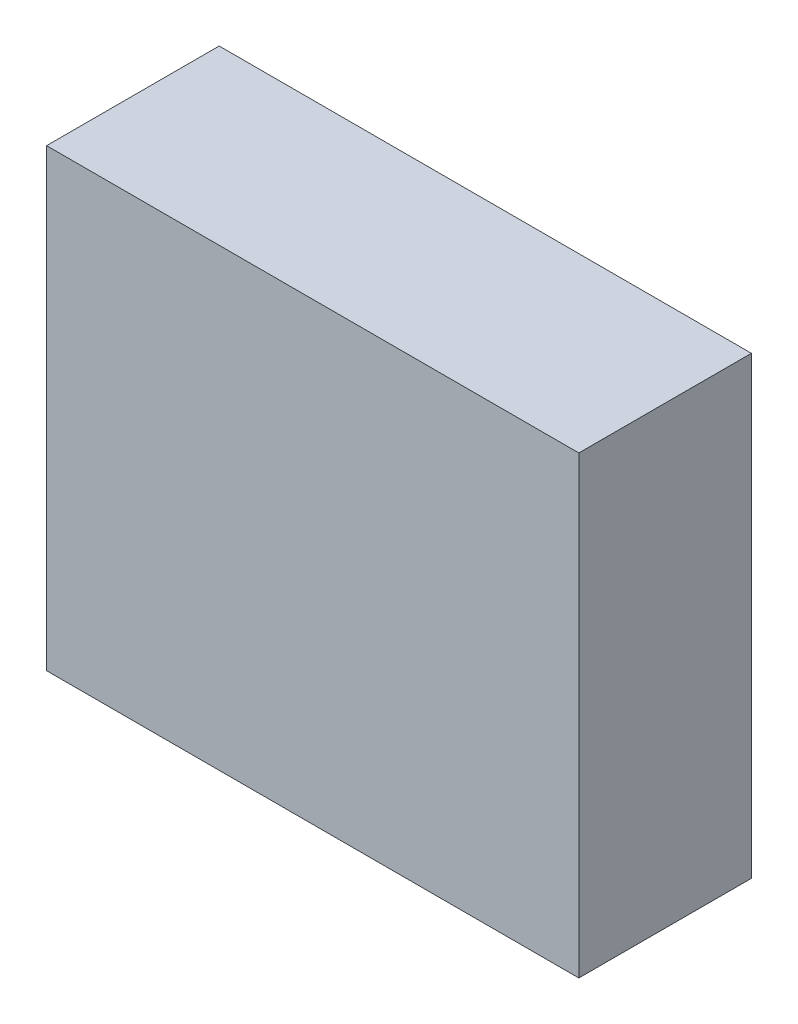
ISO-10303-21;
HEADER;
FILE_DESCRIPTION(('STEP AP214'),'2;1');
FILE_NAME('part.step','',(''),(''),'','','');
FILE_SCHEMA(('AUTOMOTIVE_DESIGN { 1 0 10303 214 1 1 1 1 }'));
ENDSEC;
DATA;
#1=APPLICATION_CONTEXT('core data for automotive mechanical design processes');
#2=APPLICATION_PROTOCOL_DEFINITION('international standard','automotive_design',2000,#1);
#3=PRODUCT_CONTEXT('',#1,'mechanical');
#4=PRODUCT('Part','Part','',(#3));
#5=PRODUCT_RELATED_PRODUCT_CATEGORY('part','',(#4));
#6=PRODUCT_DEFINITION_FORMATION('','',#4);
#7=PRODUCT_DEFINITION_CONTEXT('part definition',#1,'design');
#8=PRODUCT_DEFINITION('design','',#6,#7);
#9=PRODUCT_DEFINITION_SHAPE('','',#8);
#10=(LENGTH_UNIT() NAMED_UNIT(*) SI_UNIT(.MILLI.,.METRE.));
#11=(NAMED_UNIT(*) PLANE_ANGLE_UNIT() SI_UNIT($,.RADIAN.));
#12=(NAMED_UNIT(*) SI_UNIT($,.STERADIAN.) SOLID_ANGLE_UNIT());
#13=UNCERTAINTY_MEASURE_WITH_UNIT(LENGTH_MEASURE(1.E-05),#10,'distance_accuracy_value','');
#14=(GEOMETRIC_REPRESENTATION_CONTEXT(3) GLOBAL_UNCERTAINTY_ASSIGNED_CONTEXT((#13)) GLOBAL_UNIT_ASSIGNED_CONTEXT((#10,
#11,#12)) REPRESENTATION_CONTEXT('',''));
#15=CARTESIAN_POINT('',(0.,0.,0.));
#16=DIRECTION('',(0.,0.,1.));
#17=DIRECTION('',(1.,0.,0.));
#18=AXIS2_PLACEMENT_3D('',#15,#16,#17);
#19=CARTESIAN_POINT('',(0.004545,-0.249105,1.3));
#20=DIRECTION('',(0.,0.,1.));
#21=DIRECTION('',(1.,0.,0.));
#22=AXIS2_PLACEMENT_3D('',#19,#20,#21);
#23=PLANE('',#22);
#24=DIRECTION('',(1.,0.,0.));
#25=VECTOR('',#24,1.);
#26=CARTESIAN_POINT('',(-1.99998,-1.96163,1.3));
#27=LINE('',#26,#25);
#28=CARTESIAN_POINT('',(-1.99998,-1.96163,1.3));
#29=VERTEX_POINT('',#28);
#30=CARTESIAN_POINT('',(2.00907,-1.96163,1.3));
#31=VERTEX_POINT('',#30);
#32=EDGE_CURVE('E90',#29,#31,#27,.T.);
#33=ORIENTED_EDGE('',*,*,#32,.T.);
#34=DIRECTION('',(0.,1.,0.));
#35=VECTOR('',#34,1.);
#36=CARTESIAN_POINT('',(2.00907,-1.96163,1.3));
#37=LINE('',#36,#35);
#38=CARTESIAN_POINT('',(2.00907,1.46342,1.3));
#39=VERTEX_POINT('',#38);
#40=EDGE_CURVE('E77',#31,#39,#37,.T.);
#41=ORIENTED_EDGE('',*,*,#40,.T.);
#42=DIRECTION('',(-1.,0.,0.));
#43=VECTOR('',#42,1.);
#44=CARTESIAN_POINT('',(2.00907,1.46342,1.3));
#45=LINE('',#44,#43);
#46=CARTESIAN_POINT('',(-1.99998,1.46342,1.3));
#47=VERTEX_POINT('',#46);
#48=EDGE_CURVE('E20',#39,#47,#45,.T.);
#49=ORIENTED_EDGE('',*,*,#48,.T.);
#50=DIRECTION('',(0.,-1.,0.));
#51=VECTOR('',#50,1.);
#52=CARTESIAN_POINT('',(-1.99998,1.46342,1.3));
#53=LINE('',#52,#51);
#54=EDGE_CURVE('E11',#47,#29,#53,.T.);
#55=ORIENTED_EDGE('',*,*,#54,.T.);
#56=EDGE_LOOP('',(#33,#41,#49,#55));
#57=FACE_BOUND('',#56,.T.);
#58=ADVANCED_FACE('F16',(#57),#23,.T.);
#59=CARTESIAN_POINT('',(0.004545,-0.249105,0.));
#60=DIRECTION('',(0.,0.,1.));
#61=DIRECTION('',(1.,0.,0.));
#62=AXIS2_PLACEMENT_3D('',#59,#60,#61);
#63=PLANE('',#62);
#64=DIRECTION('',(1.,0.,0.));
#65=VECTOR('',#64,1.);
#66=CARTESIAN_POINT('',(-1.99998,-1.96163,0.));
#67=LINE('',#66,#65);
#68=CARTESIAN_POINT('',(-1.99998,-1.96163,0.));
#69=VERTEX_POINT('',#68);
#70=CARTESIAN_POINT('',(2.00907,-1.96163,0.));
#71=VERTEX_POINT('',#70);
#72=EDGE_CURVE('E99',#69,#71,#67,.T.);
#73=ORIENTED_EDGE('',*,*,#72,.F.);
#74=DIRECTION('',(0.,-1.,0.));
#75=VECTOR('',#74,1.);
#76=CARTESIAN_POINT('',(-1.99998,1.46342,0.));
#77=LINE('',#76,#75);
#78=CARTESIAN_POINT('',(-1.99998,1.46342,0.));
#79=VERTEX_POINT('',#78);
#80=EDGE_CURVE('E27',#79,#69,#77,.T.);
#81=ORIENTED_EDGE('',*,*,#80,.F.);
#82=DIRECTION('',(-1.,0.,0.));
#83=VECTOR('',#82,1.);
#84=CARTESIAN_POINT('',(2.00907,1.46342,0.));
#85=LINE('',#84,#83);
#86=CARTESIAN_POINT('',(2.00907,1.46342,0.));
#87=VERTEX_POINT('',#86);
#88=EDGE_CURVE('E66',#87,#79,#85,.T.);
#89=ORIENTED_EDGE('',*,*,#88,.F.);
#90=DIRECTION('',(0.,1.,0.));
#91=VECTOR('',#90,1.);
#92=CARTESIAN_POINT('',(2.00907,-1.96163,0.));
#93=LINE('',#92,#91);
#94=EDGE_CURVE('E71',#71,#87,#93,.T.);
#95=ORIENTED_EDGE('',*,*,#94,.F.);
#96=EDGE_LOOP('',(#73,#81,#89,#95));
#97=FACE_BOUND('',#96,.T.);
#98=ADVANCED_FACE('F69',(#97),#63,.F.);
#99=CARTESIAN_POINT('',(-1.99998,1.46342,0.));
#100=DIRECTION('',(1.,0.,0.));
#101=DIRECTION('',(0.,1.,0.));
#102=AXIS2_PLACEMENT_3D('',#99,#100,#101);
#103=PLANE('',#102);
#104=DIRECTION('',(0.,0.,1.));
#105=VECTOR('',#104,1.);
#106=CARTESIAN_POINT('',(-1.99998,1.46342,0.));
#107=LINE('',#106,#105);
#108=EDGE_CURVE('E76',#79,#47,#107,.T.);
#109=ORIENTED_EDGE('',*,*,#108,.F.);
#110=ORIENTED_EDGE('',*,*,#80,.T.);
#111=DIRECTION('',(0.,0.,1.));
#112=VECTOR('',#111,1.);
#113=CARTESIAN_POINT('',(-1.99998,-1.96163,0.));
#114=LINE('',#113,#112);
#115=EDGE_CURVE('E111',#69,#29,#114,.T.);
#116=ORIENTED_EDGE('',*,*,#115,.T.);
#117=ORIENTED_EDGE('',*,*,#54,.F.);
#118=EDGE_LOOP('',(#109,#110,#116,#117));
#119=FACE_BOUND('',#118,.T.);
#120=ADVANCED_FACE('F117',(#119),#103,.F.);
#121=CARTESIAN_POINT('',(2.00907,1.46342,0.));
#122=DIRECTION('',(0.,-1.,0.));
#123=DIRECTION('',(0.,0.,-1.));
#124=AXIS2_PLACEMENT_3D('',#121,#122,#123);
#125=PLANE('',#124);
#126=DIRECTION('',(0.,0.,1.));
#127=VECTOR('',#126,1.);
#128=CARTESIAN_POINT('',(2.00907,1.46342,0.));
#129=LINE('',#128,#127);
#130=EDGE_CURVE('E80',#87,#39,#129,.T.);
#131=ORIENTED_EDGE('',*,*,#130,.F.);
#132=ORIENTED_EDGE('',*,*,#88,.T.);
#133=ORIENTED_EDGE('',*,*,#108,.T.);
#134=ORIENTED_EDGE('',*,*,#48,.F.);
#135=EDGE_LOOP('',(#131,#132,#133,#134));
#136=FACE_BOUND('',#135,.T.);
#137=ADVANCED_FACE('F18',(#136),#125,.F.);
#138=CARTESIAN_POINT('',(2.00907,-1.96163,0.));
#139=DIRECTION('',(-1.,0.,0.));
#140=DIRECTION('',(0.,0.,1.));
#141=AXIS2_PLACEMENT_3D('',#138,#139,#140);
#142=PLANE('',#141);
#143=DIRECTION('',(0.,0.,1.));
#144=VECTOR('',#143,1.);
#145=CARTESIAN_POINT('',(2.00907,-1.96163,0.));
#146=LINE('',#145,#144);
#147=EDGE_CURVE('E87',#71,#31,#146,.T.);
#148=ORIENTED_EDGE('',*,*,#147,.F.);
#149=ORIENTED_EDGE('',*,*,#94,.T.);
#150=ORIENTED_EDGE('',*,*,#130,.T.);
#151=ORIENTED_EDGE('',*,*,#40,.F.);
#152=EDGE_LOOP('',(#148,#149,#150,#151));
#153=FACE_BOUND('',#152,.T.);
#154=ADVANCED_FACE('F85',(#153),#142,.F.);
#155=CARTESIAN_POINT('',(-1.99998,-1.96163,0.));
#156=DIRECTION('',(0.,1.,0.));
#157=DIRECTION('',(1.,0.,0.));
#158=AXIS2_PLACEMENT_3D('',#155,#156,#157);
#159=PLANE('',#158);
#160=ORIENTED_EDGE('',*,*,#115,.F.);
#161=ORIENTED_EDGE('',*,*,#72,.T.);
#162=ORIENTED_EDGE('',*,*,#147,.T.);
#163=ORIENTED_EDGE('',*,*,#32,.F.);
#164=EDGE_LOOP('',(#160,#161,#162,#163));
#165=FACE_BOUND('',#164,.T.);
#166=ADVANCED_FACE('F120',(#165),#159,.F.);
#167=CLOSED_SHELL('',(#58,#98,#120,#137,#154,#166));
#168=MANIFOLD_SOLID_BREP('B1',#167);
#169=ADVANCED_BREP_SHAPE_REPRESENTATION('',(#18,#168),#14);
#170=SHAPE_DEFINITION_REPRESENTATION(#9,#169);
ENDSEC;
END-ISO-10303-21;
